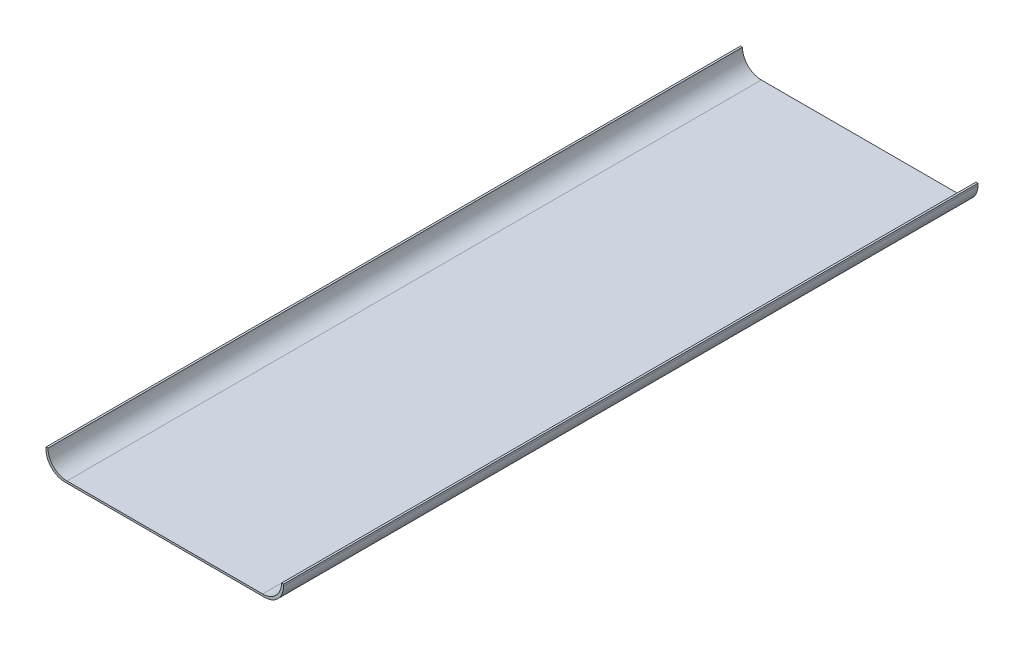
ISO-10303-21;
HEADER;
FILE_DESCRIPTION(('STEP AP214'),'2;1');
FILE_NAME('part.step','',(''),(''),'','','');
FILE_SCHEMA(('AUTOMOTIVE_DESIGN { 1 0 10303 214 1 1 1 1 }'));
ENDSEC;
DATA;
#1=APPLICATION_CONTEXT('core data for automotive mechanical design processes');
#2=APPLICATION_PROTOCOL_DEFINITION('international standard','automotive_design',2000,#1);
#3=PRODUCT_CONTEXT('',#1,'mechanical');
#4=PRODUCT('Part','Part','',(#3));
#5=PRODUCT_RELATED_PRODUCT_CATEGORY('part','',(#4));
#6=PRODUCT_DEFINITION_FORMATION('','',#4);
#7=PRODUCT_DEFINITION_CONTEXT('part definition',#1,'design');
#8=PRODUCT_DEFINITION('design','',#6,#7);
#9=PRODUCT_DEFINITION_SHAPE('','',#8);
#10=(LENGTH_UNIT() NAMED_UNIT(*) SI_UNIT(.MILLI.,.METRE.));
#11=(NAMED_UNIT(*) PLANE_ANGLE_UNIT() SI_UNIT($,.RADIAN.));
#12=(NAMED_UNIT(*) SI_UNIT($,.STERADIAN.) SOLID_ANGLE_UNIT());
#13=UNCERTAINTY_MEASURE_WITH_UNIT(LENGTH_MEASURE(1.E-05),#10,'distance_accuracy_value','');
#14=(GEOMETRIC_REPRESENTATION_CONTEXT(3) GLOBAL_UNCERTAINTY_ASSIGNED_CONTEXT((#13)) GLOBAL_UNIT_ASSIGNED_CONTEXT((#10,
#11,#12)) REPRESENTATION_CONTEXT('',''));
#15=CARTESIAN_POINT('',(0.,0.,0.));
#16=DIRECTION('',(0.,0.,1.));
#17=DIRECTION('',(1.,0.,0.));
#18=AXIS2_PLACEMENT_3D('',#15,#16,#17);
#19=CARTESIAN_POINT('',(-39.3699999999992,-39.3699999999992,279.4));
#20=DIRECTION('',(0.,0.,-1.));
#21=DIRECTION('',(-1.,0.,0.));
#22=AXIS2_PLACEMENT_3D('',#19,#20,#21);
#23=CYLINDRICAL_SURFACE('',#22,7.62);
#24=CARTESIAN_POINT('',(-39.3699999999992,-39.3699999999992,0.));
#25=DIRECTION('',(0.,0.,-1.));
#26=DIRECTION('',(-1.,0.,0.));
#27=AXIS2_PLACEMENT_3D('',#24,#25,#26);
#28=CIRCLE('',#27,7.62);
#29=CARTESIAN_POINT('',(-39.3699999999992,-46.9899999999992,0.));
#30=VERTEX_POINT('',#29);
#31=CARTESIAN_POINT('',(-46.9899999999992,-39.3699999999992,0.));
#32=VERTEX_POINT('',#31);
#33=EDGE_CURVE('E155',#30,#32,#28,.T.);
#34=ORIENTED_EDGE('',*,*,#33,.T.);
#35=DIRECTION('',(0.,0.,-1.));
#36=VECTOR('',#35,1.);
#37=CARTESIAN_POINT('',(-46.9899999999992,-39.3699999999992,279.4));
#38=LINE('',#37,#36);
#39=CARTESIAN_POINT('',(-46.9899999999992,-39.3699999999992,279.4));
#40=VERTEX_POINT('',#39);
#41=EDGE_CURVE('E11',#40,#32,#38,.T.);
#42=ORIENTED_EDGE('',*,*,#41,.F.);
#43=CARTESIAN_POINT('',(-39.3699999999992,-39.3699999999992,279.4));
#44=DIRECTION('',(0.,0.,-1.));
#45=DIRECTION('',(-1.,0.,0.));
#46=AXIS2_PLACEMENT_3D('',#43,#44,#45);
#47=CIRCLE('',#46,7.62);
#48=CARTESIAN_POINT('',(-39.3699999999992,-46.9899999999992,279.4));
#49=VERTEX_POINT('',#48);
#50=EDGE_CURVE('E183',#49,#40,#47,.T.);
#51=ORIENTED_EDGE('',*,*,#50,.F.);
#52=DIRECTION('',(0.,0.,-1.));
#53=VECTOR('',#52,1.);
#54=CARTESIAN_POINT('',(-39.3699999999992,-46.9899999999992,279.4));
#55=LINE('',#54,#53);
#56=EDGE_CURVE('E151',#49,#30,#55,.T.);
#57=ORIENTED_EDGE('',*,*,#56,.T.);
#58=EDGE_LOOP('',(#34,#42,#51,#57));
#59=FACE_BOUND('',#58,.T.);
#60=ADVANCED_FACE('F42',(#59),#23,.F.);
#61=CARTESIAN_POINT('',(-46.9899999999992,-39.3699999999992,279.4));
#62=DIRECTION('',(0.,-1.,0.));
#63=DIRECTION('',(1.,0.,0.));
#64=AXIS2_PLACEMENT_3D('',#61,#62,#63);
#65=PLANE('',#64);
#66=DIRECTION('',(-1.,0.,0.));
#67=VECTOR('',#66,1.);
#68=CARTESIAN_POINT('',(-46.9899999999992,-39.3699999999992,0.));
#69=LINE('',#68,#67);
#70=CARTESIAN_POINT('',(-47.7837499999992,-39.3699999999992,0.));
#71=VERTEX_POINT('',#70);
#72=EDGE_CURVE('E159',#32,#71,#69,.T.);
#73=ORIENTED_EDGE('',*,*,#72,.T.);
#74=DIRECTION('',(0.,0.,-1.));
#75=VECTOR('',#74,1.);
#76=CARTESIAN_POINT('',(-47.7837499999992,-39.3699999999992,279.4));
#77=LINE('',#76,#75);
#78=CARTESIAN_POINT('',(-47.7837499999992,-39.3699999999992,279.4));
#79=VERTEX_POINT('',#78);
#80=EDGE_CURVE('E51',#79,#71,#77,.T.);
#81=ORIENTED_EDGE('',*,*,#80,.F.);
#82=DIRECTION('',(-1.,0.,0.));
#83=VECTOR('',#82,1.);
#84=CARTESIAN_POINT('',(-46.9899999999992,-39.3699999999992,279.4));
#85=LINE('',#84,#83);
#86=EDGE_CURVE('E108',#40,#79,#85,.T.);
#87=ORIENTED_EDGE('',*,*,#86,.F.);
#88=ORIENTED_EDGE('',*,*,#41,.T.);
#89=EDGE_LOOP('',(#73,#81,#87,#88));
#90=FACE_BOUND('',#89,.T.);
#91=ADVANCED_FACE('F247',(#90),#65,.F.);
#92=CARTESIAN_POINT('',(-47.7837499999992,-39.3699999999992,279.4));
#93=DIRECTION('',(1.,0.,0.));
#94=DIRECTION('',(0.,1.,0.));
#95=AXIS2_PLACEMENT_3D('',#92,#93,#94);
#96=PLANE('',#95);
#97=DIRECTION('',(0.,-1.,0.));
#98=VECTOR('',#97,1.);
#99=CARTESIAN_POINT('',(-47.7837499999992,-39.3699999999992,0.));
#100=LINE('',#99,#98);
#101=CARTESIAN_POINT('',(-47.7837499999992,-40.1637499999992,0.));
#102=VERTEX_POINT('',#101);
#103=EDGE_CURVE('E162',#71,#102,#100,.T.);
#104=ORIENTED_EDGE('',*,*,#103,.T.);
#105=DIRECTION('',(0.,0.,-1.));
#106=VECTOR('',#105,1.);
#107=CARTESIAN_POINT('',(-47.7837499999992,-40.1637499999992,279.4));
#108=LINE('',#107,#106);
#109=CARTESIAN_POINT('',(-47.7837499999992,-40.1637499999992,279.4));
#110=VERTEX_POINT('',#109);
#111=EDGE_CURVE('E202',#110,#102,#108,.T.);
#112=ORIENTED_EDGE('',*,*,#111,.F.);
#113=DIRECTION('',(0.,-1.,0.));
#114=VECTOR('',#113,1.);
#115=CARTESIAN_POINT('',(-47.7837499999992,-39.3699999999992,279.4));
#116=LINE('',#115,#114);
#117=EDGE_CURVE('E212',#79,#110,#116,.T.);
#118=ORIENTED_EDGE('',*,*,#117,.F.);
#119=ORIENTED_EDGE('',*,*,#80,.T.);
#120=EDGE_LOOP('',(#104,#112,#118,#119));
#121=FACE_BOUND('',#120,.T.);
#122=ADVANCED_FACE('F210',(#121),#96,.F.);
#123=CARTESIAN_POINT('',(-40.1637499999992,-40.1637499999992,279.4));
#124=DIRECTION('',(0.,0.,-1.));
#125=DIRECTION('',(-1.,0.,0.));
#126=AXIS2_PLACEMENT_3D('',#123,#124,#125);
#127=CYLINDRICAL_SURFACE('',#126,7.62);
#128=CARTESIAN_POINT('',(-40.1637499999992,-40.1637499999992,0.));
#129=DIRECTION('',(0.,0.,1.));
#130=DIRECTION('',(-1.,0.,0.));
#131=AXIS2_PLACEMENT_3D('',#128,#129,#130);
#132=CIRCLE('',#131,7.62);
#133=CARTESIAN_POINT('',(-40.1637499999992,-47.7837499999992,0.));
#134=VERTEX_POINT('',#133);
#135=EDGE_CURVE('E165',#102,#134,#132,.T.);
#136=ORIENTED_EDGE('',*,*,#135,.T.);
#137=DIRECTION('',(0.,0.,-1.));
#138=VECTOR('',#137,1.);
#139=CARTESIAN_POINT('',(-40.1637499999992,-47.7837499999992,279.4));
#140=LINE('',#139,#138);
#141=CARTESIAN_POINT('',(-40.1637499999992,-47.7837499999992,279.4));
#142=VERTEX_POINT('',#141);
#143=EDGE_CURVE('E198',#142,#134,#140,.T.);
#144=ORIENTED_EDGE('',*,*,#143,.F.);
#145=CARTESIAN_POINT('',(-40.1637499999992,-40.1637499999992,279.4));
#146=DIRECTION('',(0.,0.,1.));
#147=DIRECTION('',(-1.,0.,0.));
#148=AXIS2_PLACEMENT_3D('',#145,#146,#147);
#149=CIRCLE('',#148,7.62);
#150=EDGE_CURVE('E231',#110,#142,#149,.T.);
#151=ORIENTED_EDGE('',*,*,#150,.F.);
#152=ORIENTED_EDGE('',*,*,#111,.T.);
#153=EDGE_LOOP('',(#136,#144,#151,#152));
#154=FACE_BOUND('',#153,.T.);
#155=ADVANCED_FACE('F221',(#154),#127,.T.);
#156=CARTESIAN_POINT('',(-40.1637499999992,-47.7837499999992,279.4));
#157=DIRECTION('',(0.,1.,0.));
#158=DIRECTION('',(0.,0.,1.));
#159=AXIS2_PLACEMENT_3D('',#156,#157,#158);
#160=PLANE('',#159);
#161=DIRECTION('',(1.,0.,0.));
#162=VECTOR('',#161,1.);
#163=CARTESIAN_POINT('',(-40.1637499999992,-47.7837499999992,0.));
#164=LINE('',#163,#162);
#165=CARTESIAN_POINT('',(40.1637500000008,-47.7837499999992,0.));
#166=VERTEX_POINT('',#165);
#167=EDGE_CURVE('E168',#134,#166,#164,.T.);
#168=ORIENTED_EDGE('',*,*,#167,.T.);
#169=DIRECTION('',(0.,0.,-1.));
#170=VECTOR('',#169,1.);
#171=CARTESIAN_POINT('',(40.1637500000008,-47.7837499999992,279.4));
#172=LINE('',#171,#170);
#173=CARTESIAN_POINT('',(40.1637500000008,-47.7837499999992,279.4));
#174=VERTEX_POINT('',#173);
#175=EDGE_CURVE('E194',#174,#166,#172,.T.);
#176=ORIENTED_EDGE('',*,*,#175,.F.);
#177=DIRECTION('',(1.,0.,0.));
#178=VECTOR('',#177,1.);
#179=CARTESIAN_POINT('',(-40.1637499999992,-47.7837499999992,279.4));
#180=LINE('',#179,#178);
#181=EDGE_CURVE('E227',#142,#174,#180,.T.);
#182=ORIENTED_EDGE('',*,*,#181,.F.);
#183=ORIENTED_EDGE('',*,*,#143,.T.);
#184=EDGE_LOOP('',(#168,#176,#182,#183));
#185=FACE_BOUND('',#184,.T.);
#186=ADVANCED_FACE('F225',(#185),#160,.F.);
#187=CARTESIAN_POINT('',(40.1637500000008,-40.1637499999992,279.4));
#188=DIRECTION('',(0.,0.,-1.));
#189=DIRECTION('',(-1.,0.,0.));
#190=AXIS2_PLACEMENT_3D('',#187,#188,#189);
#191=CYLINDRICAL_SURFACE('',#190,7.62000000000001);
#192=CARTESIAN_POINT('',(40.1637500000008,-40.1637499999992,0.));
#193=DIRECTION('',(0.,0.,1.));
#194=DIRECTION('',(-1.,0.,0.));
#195=AXIS2_PLACEMENT_3D('',#192,#193,#194);
#196=CIRCLE('',#195,7.62000000000001);
#197=CARTESIAN_POINT('',(47.7837500000008,-40.1637499999992,0.));
#198=VERTEX_POINT('',#197);
#199=EDGE_CURVE('E171',#166,#198,#196,.T.);
#200=ORIENTED_EDGE('',*,*,#199,.T.);
#201=DIRECTION('',(0.,0.,-1.));
#202=VECTOR('',#201,1.);
#203=CARTESIAN_POINT('',(47.7837500000008,-40.1637499999992,279.4));
#204=LINE('',#203,#202);
#205=CARTESIAN_POINT('',(47.7837500000008,-40.1637499999992,279.4));
#206=VERTEX_POINT('',#205);
#207=EDGE_CURVE('E190',#206,#198,#204,.T.);
#208=ORIENTED_EDGE('',*,*,#207,.F.);
#209=CARTESIAN_POINT('',(40.1637500000008,-40.1637499999992,279.4));
#210=DIRECTION('',(0.,0.,1.));
#211=DIRECTION('',(-1.,0.,0.));
#212=AXIS2_PLACEMENT_3D('',#209,#210,#211);
#213=CIRCLE('',#212,7.62000000000001);
#214=EDGE_CURVE('E230',#174,#206,#213,.T.);
#215=ORIENTED_EDGE('',*,*,#214,.F.);
#216=ORIENTED_EDGE('',*,*,#175,.T.);
#217=EDGE_LOOP('',(#200,#208,#215,#216));
#218=FACE_BOUND('',#217,.T.);
#219=ADVANCED_FACE('F259',(#218),#191,.T.);
#220=CARTESIAN_POINT('',(47.7837500000008,-39.3699999999992,279.4));
#221=DIRECTION('',(-1.,0.,0.));
#222=DIRECTION('',(0.,0.,1.));
#223=AXIS2_PLACEMENT_3D('',#220,#221,#222);
#224=PLANE('',#223);
#225=DIRECTION('',(0.,1.,0.));
#226=VECTOR('',#225,1.);
#227=CARTESIAN_POINT('',(47.7837500000008,-39.3699999999992,0.));
#228=LINE('',#227,#226);
#229=CARTESIAN_POINT('',(47.7837500000008,-39.3699999999992,0.));
#230=VERTEX_POINT('',#229);
#231=EDGE_CURVE('E174',#198,#230,#228,.T.);
#232=ORIENTED_EDGE('',*,*,#231,.T.);
#233=DIRECTION('',(0.,0.,-1.));
#234=VECTOR('',#233,1.);
#235=CARTESIAN_POINT('',(47.7837500000008,-39.3699999999992,279.4));
#236=LINE('',#235,#234);
#237=CARTESIAN_POINT('',(47.7837500000008,-39.3699999999992,279.4));
#238=VERTEX_POINT('',#237);
#239=EDGE_CURVE('E144',#238,#230,#236,.T.);
#240=ORIENTED_EDGE('',*,*,#239,.F.);
#241=DIRECTION('',(0.,1.,0.));
#242=VECTOR('',#241,1.);
#243=CARTESIAN_POINT('',(47.7837500000008,-39.3699999999992,279.4));
#244=LINE('',#243,#242);
#245=EDGE_CURVE('E133',#206,#238,#244,.T.);
#246=ORIENTED_EDGE('',*,*,#245,.F.);
#247=ORIENTED_EDGE('',*,*,#207,.T.);
#248=EDGE_LOOP('',(#232,#240,#246,#247));
#249=FACE_BOUND('',#248,.T.);
#250=ADVANCED_FACE('F262',(#249),#224,.F.);
#251=CARTESIAN_POINT('',(46.9900000000008,-39.3699999999992,279.4));
#252=DIRECTION('',(0.,-1.,0.));
#253=DIRECTION('',(1.,0.,0.));
#254=AXIS2_PLACEMENT_3D('',#251,#252,#253);
#255=PLANE('',#254);
#256=DIRECTION('',(-1.,0.,0.));
#257=VECTOR('',#256,1.);
#258=CARTESIAN_POINT('',(46.9900000000008,-39.3699999999992,0.));
#259=LINE('',#258,#257);
#260=CARTESIAN_POINT('',(46.9900000000008,-39.3699999999992,0.));
#261=VERTEX_POINT('',#260);
#262=EDGE_CURVE('E142',#230,#261,#259,.T.);
#263=ORIENTED_EDGE('',*,*,#262,.T.);
#264=DIRECTION('',(0.,0.,-1.));
#265=VECTOR('',#264,1.);
#266=CARTESIAN_POINT('',(46.9900000000008,-39.3699999999992,279.4));
#267=LINE('',#266,#265);
#268=CARTESIAN_POINT('',(46.9900000000008,-39.3699999999992,279.4));
#269=VERTEX_POINT('',#268);
#270=EDGE_CURVE('E139',#269,#261,#267,.T.);
#271=ORIENTED_EDGE('',*,*,#270,.F.);
#272=DIRECTION('',(-1.,0.,0.));
#273=VECTOR('',#272,1.);
#274=CARTESIAN_POINT('',(46.9900000000008,-39.3699999999992,279.4));
#275=LINE('',#274,#273);
#276=EDGE_CURVE('E127',#238,#269,#275,.T.);
#277=ORIENTED_EDGE('',*,*,#276,.F.);
#278=ORIENTED_EDGE('',*,*,#239,.T.);
#279=EDGE_LOOP('',(#263,#271,#277,#278));
#280=FACE_BOUND('',#279,.T.);
#281=ADVANCED_FACE('F140',(#280),#255,.F.);
#282=CARTESIAN_POINT('',(39.3700000000008,-39.3699999999992,279.4));
#283=DIRECTION('',(0.,0.,-1.));
#284=DIRECTION('',(-1.,0.,0.));
#285=AXIS2_PLACEMENT_3D('',#282,#283,#284);
#286=CYLINDRICAL_SURFACE('',#285,7.62);
#287=CARTESIAN_POINT('',(39.3700000000008,-39.3699999999992,0.));
#288=DIRECTION('',(0.,0.,-1.));
#289=DIRECTION('',(-1.,0.,0.));
#290=AXIS2_PLACEMENT_3D('',#287,#288,#289);
#291=CIRCLE('',#290,7.62);
#292=CARTESIAN_POINT('',(39.3700000000008,-46.9899999999992,0.));
#293=VERTEX_POINT('',#292);
#294=EDGE_CURVE('E94',#261,#293,#291,.T.);
#295=ORIENTED_EDGE('',*,*,#294,.T.);
#296=DIRECTION('',(0.,0.,-1.));
#297=VECTOR('',#296,1.);
#298=CARTESIAN_POINT('',(39.3700000000008,-46.9899999999992,279.4));
#299=LINE('',#298,#297);
#300=CARTESIAN_POINT('',(39.3700000000008,-46.9899999999992,279.4));
#301=VERTEX_POINT('',#300);
#302=EDGE_CURVE('E145',#301,#293,#299,.T.);
#303=ORIENTED_EDGE('',*,*,#302,.F.);
#304=CARTESIAN_POINT('',(39.3700000000008,-39.3699999999992,279.4));
#305=DIRECTION('',(0.,0.,-1.));
#306=DIRECTION('',(-1.,0.,0.));
#307=AXIS2_PLACEMENT_3D('',#304,#305,#306);
#308=CIRCLE('',#307,7.62);
#309=EDGE_CURVE('E131',#269,#301,#308,.T.);
#310=ORIENTED_EDGE('',*,*,#309,.F.);
#311=ORIENTED_EDGE('',*,*,#270,.T.);
#312=EDGE_LOOP('',(#295,#303,#310,#311));
#313=FACE_BOUND('',#312,.T.);
#314=ADVANCED_FACE('F147',(#313),#286,.F.);
#315=CARTESIAN_POINT('',(-39.3699999999992,-46.9899999999992,279.4));
#316=DIRECTION('',(0.,-1.,0.));
#317=DIRECTION('',(1.,0.,0.));
#318=AXIS2_PLACEMENT_3D('',#315,#316,#317);
#319=PLANE('',#318);
#320=DIRECTION('',(-1.,0.,0.));
#321=VECTOR('',#320,1.);
#322=CARTESIAN_POINT('',(-39.3699999999992,-46.9899999999992,0.));
#323=LINE('',#322,#321);
#324=EDGE_CURVE('E100',#293,#30,#323,.T.);
#325=ORIENTED_EDGE('',*,*,#324,.T.);
#326=ORIENTED_EDGE('',*,*,#56,.F.);
#327=DIRECTION('',(-1.,0.,0.));
#328=VECTOR('',#327,1.);
#329=CARTESIAN_POINT('',(-39.3699999999992,-46.9899999999992,279.4));
#330=LINE('',#329,#328);
#331=EDGE_CURVE('E59',#301,#49,#330,.T.);
#332=ORIENTED_EDGE('',*,*,#331,.F.);
#333=ORIENTED_EDGE('',*,*,#302,.T.);
#334=EDGE_LOOP('',(#325,#326,#332,#333));
#335=FACE_BOUND('',#334,.T.);
#336=ADVANCED_FACE('F271',(#335),#319,.F.);
#337=CARTESIAN_POINT('',(-39.3699999999992,-39.3699999999992,279.4));
#338=DIRECTION('',(0.,0.,-1.));
#339=DIRECTION('',(-1.,0.,0.));
#340=AXIS2_PLACEMENT_3D('',#337,#338,#339);
#341=PLANE('',#340);
#342=ORIENTED_EDGE('',*,*,#50,.T.);
#343=ORIENTED_EDGE('',*,*,#86,.T.);
#344=ORIENTED_EDGE('',*,*,#117,.T.);
#345=ORIENTED_EDGE('',*,*,#150,.T.);
#346=ORIENTED_EDGE('',*,*,#181,.T.);
#347=ORIENTED_EDGE('',*,*,#214,.T.);
#348=ORIENTED_EDGE('',*,*,#245,.T.);
#349=ORIENTED_EDGE('',*,*,#276,.T.);
#350=ORIENTED_EDGE('',*,*,#309,.T.);
#351=ORIENTED_EDGE('',*,*,#331,.T.);
#352=EDGE_LOOP('',(#342,#343,#344,#345,#346,#347,#348,#349,#350,#351));
#353=FACE_BOUND('',#352,.T.);
#354=ADVANCED_FACE('F129',(#353),#341,.F.);
#355=CARTESIAN_POINT('',(-39.3699999999992,-39.3699999999992,0.));
#356=DIRECTION('',(0.,0.,-1.));
#357=DIRECTION('',(-1.,0.,0.));
#358=AXIS2_PLACEMENT_3D('',#355,#356,#357);
#359=PLANE('',#358);
#360=ORIENTED_EDGE('',*,*,#33,.F.);
#361=ORIENTED_EDGE('',*,*,#324,.F.);
#362=ORIENTED_EDGE('',*,*,#294,.F.);
#363=ORIENTED_EDGE('',*,*,#262,.F.);
#364=ORIENTED_EDGE('',*,*,#231,.F.);
#365=ORIENTED_EDGE('',*,*,#199,.F.);
#366=ORIENTED_EDGE('',*,*,#167,.F.);
#367=ORIENTED_EDGE('',*,*,#135,.F.);
#368=ORIENTED_EDGE('',*,*,#103,.F.);
#369=ORIENTED_EDGE('',*,*,#72,.F.);
#370=EDGE_LOOP('',(#360,#361,#362,#363,#364,#365,#366,#367,#368,#369));
#371=FACE_BOUND('',#370,.T.);
#372=ADVANCED_FACE('F216',(#371),#359,.T.);
#373=CLOSED_SHELL('',(#60,#91,#122,#155,#186,#219,#250,#281,#314,#336,#354,#372));
#374=MANIFOLD_SOLID_BREP('B2',#373);
#375=ADVANCED_BREP_SHAPE_REPRESENTATION('',(#18,#374),#14);
#376=SHAPE_DEFINITION_REPRESENTATION(#9,#375);
ENDSEC;
END-ISO-10303-21;
